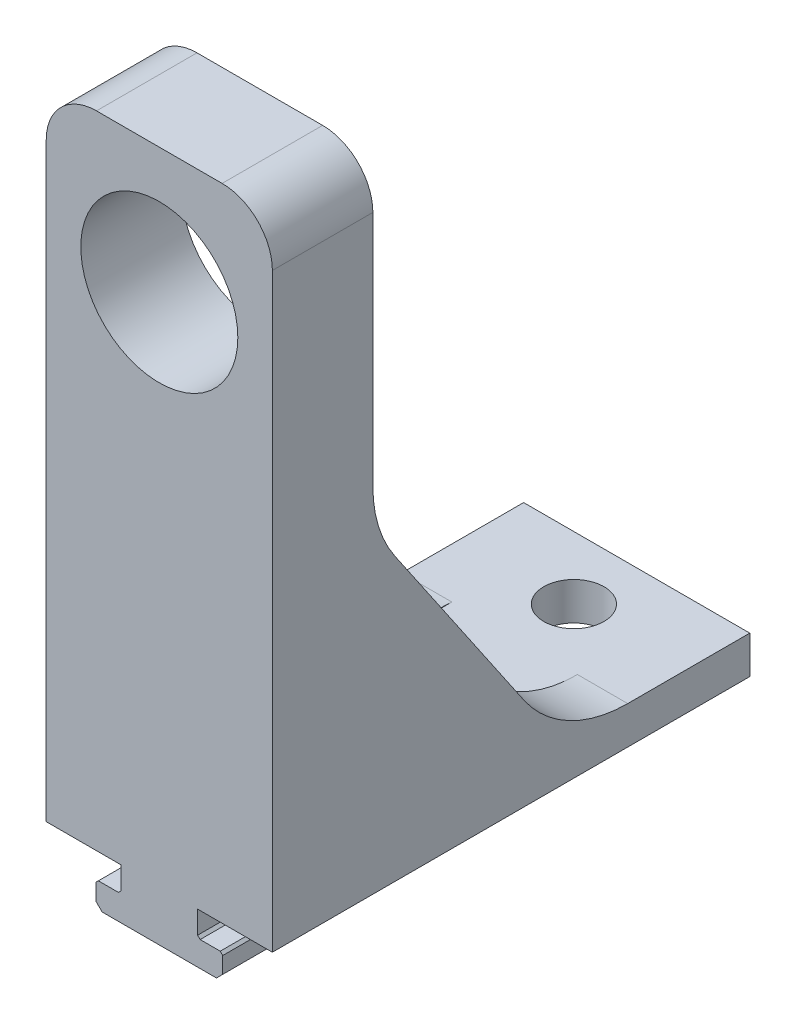
ISO-10303-21;
HEADER;
FILE_DESCRIPTION(('STEP AP214'),'2;1');
FILE_NAME('part.step','',(''),(''),'','','');
FILE_SCHEMA(('AUTOMOTIVE_DESIGN { 1 0 10303 214 1 1 1 1 }'));
ENDSEC;
DATA;
#1=APPLICATION_CONTEXT('core data for automotive mechanical design processes');
#2=APPLICATION_PROTOCOL_DEFINITION('international standard','automotive_design',2000,#1);
#3=PRODUCT_CONTEXT('',#1,'mechanical');
#4=PRODUCT('Part','Part','',(#3));
#5=PRODUCT_RELATED_PRODUCT_CATEGORY('part','',(#4));
#6=PRODUCT_DEFINITION_FORMATION('','',#4);
#7=PRODUCT_DEFINITION_CONTEXT('part definition',#1,'design');
#8=PRODUCT_DEFINITION('design','',#6,#7);
#9=PRODUCT_DEFINITION_SHAPE('','',#8);
#10=(LENGTH_UNIT() NAMED_UNIT(*) SI_UNIT(.MILLI.,.METRE.));
#11=(NAMED_UNIT(*) PLANE_ANGLE_UNIT() SI_UNIT($,.RADIAN.));
#12=(NAMED_UNIT(*) SI_UNIT($,.STERADIAN.) SOLID_ANGLE_UNIT());
#13=UNCERTAINTY_MEASURE_WITH_UNIT(LENGTH_MEASURE(1.E-05),#10,'distance_accuracy_value','');
#14=(GEOMETRIC_REPRESENTATION_CONTEXT(3) GLOBAL_UNCERTAINTY_ASSIGNED_CONTEXT((#13)) GLOBAL_UNIT_ASSIGNED_CONTEXT((#10,
#11,#12)) REPRESENTATION_CONTEXT('',''));
#15=CARTESIAN_POINT('',(0.,0.,0.));
#16=DIRECTION('',(0.,0.,1.));
#17=DIRECTION('',(1.,0.,0.));
#18=AXIS2_PLACEMENT_3D('',#15,#16,#17);
#19=CARTESIAN_POINT('',(0.,10.,-4.));
#20=DIRECTION('',(0.,1.,0.));
#21=DIRECTION('',(0.,0.,1.));
#22=AXIS2_PLACEMENT_3D('',#19,#20,#21);
#23=PLANE('',#22);
#24=CARTESIAN_POINT('',(0.,10.,-29.));
#25=DIRECTION('',(0.,1.,0.));
#26=DIRECTION('',(0.,0.,1.));
#27=AXIS2_PLACEMENT_3D('',#24,#25,#26);
#28=CIRCLE('',#27,2.4);
#29=CARTESIAN_POINT('',(0.,10.,-26.6));
#30=VERTEX_POINT('',#29);
#31=EDGE_CURVE('E243',#30,#30,#28,.T.);
#32=ORIENTED_EDGE('',*,*,#31,.T.);
#33=EDGE_LOOP('',(#32));
#34=FACE_BOUND('',#33,.T.);
#35=DIRECTION('',(0.,0.,1.));
#36=VECTOR('',#35,1.);
#37=CARTESIAN_POINT('',(3.05,10.,-4.));
#38=LINE('',#37,#36);
#39=CARTESIAN_POINT('',(3.05,10.,-22.));
#40=VERTEX_POINT('',#39);
#41=CARTESIAN_POINT('',(3.05,10.,4.));
#42=VERTEX_POINT('',#41);
#43=EDGE_CURVE('E237',#40,#42,#38,.T.);
#44=ORIENTED_EDGE('',*,*,#43,.F.);
#45=DIRECTION('',(-1.,0.,0.));
#46=VECTOR('',#45,1.);
#47=CARTESIAN_POINT('',(0.,10.,-22.));
#48=LINE('',#47,#46);
#49=CARTESIAN_POINT('',(-3.05,10.,-22.));
#50=VERTEX_POINT('',#49);
#51=EDGE_CURVE('E242',#40,#50,#48,.T.);
#52=ORIENTED_EDGE('',*,*,#51,.T.);
#53=DIRECTION('',(0.,0.,1.));
#54=VECTOR('',#53,1.);
#55=CARTESIAN_POINT('',(-3.05,10.,-4.));
#56=LINE('',#55,#54);
#57=CARTESIAN_POINT('',(-3.05,10.,4.));
#58=VERTEX_POINT('',#57);
#59=EDGE_CURVE('E381',#50,#58,#56,.T.);
#60=ORIENTED_EDGE('',*,*,#59,.T.);
#61=DIRECTION('',(-1.,0.,0.));
#62=VECTOR('',#61,1.);
#63=CARTESIAN_POINT('',(0.,10.,4.));
#64=LINE('',#63,#62);
#65=CARTESIAN_POINT('',(-9.,10.,4.));
#66=VERTEX_POINT('',#65);
#67=EDGE_CURVE('E321',#58,#66,#64,.T.);
#68=ORIENTED_EDGE('',*,*,#67,.T.);
#69=DIRECTION('',(0.,0.,1.));
#70=VECTOR('',#69,1.);
#71=CARTESIAN_POINT('',(-9.,10.,-4.));
#72=LINE('',#71,#70);
#73=CARTESIAN_POINT('',(-9.,10.,-34.));
#74=VERTEX_POINT('',#73);
#75=EDGE_CURVE('E383',#74,#66,#72,.T.);
#76=ORIENTED_EDGE('',*,*,#75,.F.);
#77=DIRECTION('',(-1.,0.,0.));
#78=VECTOR('',#77,1.);
#79=CARTESIAN_POINT('',(0.,10.,-34.));
#80=LINE('',#79,#78);
#81=CARTESIAN_POINT('',(9.,10.,-34.));
#82=VERTEX_POINT('',#81);
#83=EDGE_CURVE('E299',#82,#74,#80,.T.);
#84=ORIENTED_EDGE('',*,*,#83,.F.);
#85=DIRECTION('',(0.,0.,1.));
#86=VECTOR('',#85,1.);
#87=CARTESIAN_POINT('',(9.,10.,-4.));
#88=LINE('',#87,#86);
#89=CARTESIAN_POINT('',(9.,10.,4.));
#90=VERTEX_POINT('',#89);
#91=EDGE_CURVE('E250',#82,#90,#88,.T.);
#92=ORIENTED_EDGE('',*,*,#91,.T.);
#93=EDGE_CURVE('E248',#90,#42,#64,.T.);
#94=ORIENTED_EDGE('',*,*,#93,.T.);
#95=EDGE_LOOP('',(#44,#52,#60,#68,#76,#84,#92,#94));
#96=FACE_BOUND('',#95,.T.);
#97=ADVANCED_FACE('F38',(#34,#96),#23,.F.);
#98=CARTESIAN_POINT('',(0.,0.,-4.));
#99=DIRECTION('',(0.,0.,1.));
#100=DIRECTION('',(1.,0.,0.));
#101=AXIS2_PLACEMENT_3D('',#98,#99,#100);
#102=PLANE('',#101);
#103=CARTESIAN_POINT('',(0.,51.,-4.));
#104=DIRECTION('',(0.,0.,1.));
#105=DIRECTION('',(1.,0.,0.));
#106=AXIS2_PLACEMENT_3D('',#103,#104,#105);
#107=CIRCLE('',#106,6.25);
#108=CARTESIAN_POINT('',(6.25,51.,-4.));
#109=VERTEX_POINT('',#108);
#110=EDGE_CURVE('E251',#109,#109,#107,.T.);
#111=ORIENTED_EDGE('',*,*,#110,.T.);
#112=EDGE_LOOP('',(#111));
#113=FACE_BOUND('',#112,.T.);
#114=DIRECTION('',(0.,-1.,0.));
#115=VECTOR('',#114,1.);
#116=CARTESIAN_POINT('',(-5.,0.,-4.));
#117=LINE('',#116,#115);
#118=CARTESIAN_POINT('',(-4.99999999999992,38.0847026075925,-4.));
#119=VERTEX_POINT('',#118);
#120=CARTESIAN_POINT('',(-4.99999999999997,13.,-4.));
#121=VERTEX_POINT('',#120);
#122=EDGE_CURVE('E286',#119,#121,#117,.T.);
#123=ORIENTED_EDGE('',*,*,#122,.F.);
#124=DIRECTION('',(-1.,0.,0.));
#125=VECTOR('',#124,1.);
#126=CARTESIAN_POINT('',(0.,38.0847026075924,-4.));
#127=LINE('',#126,#125);
#128=CARTESIAN_POINT('',(-9.,38.0847026075925,-4.));
#129=VERTEX_POINT('',#128);
#130=EDGE_CURVE('E418',#119,#129,#127,.T.);
#131=ORIENTED_EDGE('',*,*,#130,.T.);
#132=DIRECTION('',(0.,1.,0.));
#133=VECTOR('',#132,1.);
#134=CARTESIAN_POINT('',(-9.,0.,-4.));
#135=LINE('',#134,#133);
#136=CARTESIAN_POINT('',(-9.,57.,-4.));
#137=VERTEX_POINT('',#136);
#138=EDGE_CURVE('E366',#129,#137,#135,.T.);
#139=ORIENTED_EDGE('',*,*,#138,.T.);
#140=CARTESIAN_POINT('',(-5.,57.,-4.));
#141=DIRECTION('',(0.,0.,1.));
#142=DIRECTION('',(1.,0.,0.));
#143=AXIS2_PLACEMENT_3D('',#140,#141,#142);
#144=CIRCLE('',#143,4.);
#145=CARTESIAN_POINT('',(-5.,61.,-4.));
#146=VERTEX_POINT('',#145);
#147=EDGE_CURVE('E364',#137,#146,#144,.F.);
#148=ORIENTED_EDGE('',*,*,#147,.T.);
#149=DIRECTION('',(1.,0.,0.));
#150=VECTOR('',#149,1.);
#151=CARTESIAN_POINT('',(0.,61.,-4.));
#152=LINE('',#151,#150);
#153=CARTESIAN_POINT('',(5.,61.,-4.));
#154=VERTEX_POINT('',#153);
#155=EDGE_CURVE('E362',#146,#154,#152,.T.);
#156=ORIENTED_EDGE('',*,*,#155,.T.);
#157=CARTESIAN_POINT('',(5.,57.,-4.));
#158=DIRECTION('',(0.,0.,1.));
#159=DIRECTION('',(1.,0.,0.));
#160=AXIS2_PLACEMENT_3D('',#157,#158,#159);
#161=CIRCLE('',#160,4.);
#162=CARTESIAN_POINT('',(9.,57.,-4.));
#163=VERTEX_POINT('',#162);
#164=EDGE_CURVE('E360',#154,#163,#161,.F.);
#165=ORIENTED_EDGE('',*,*,#164,.T.);
#166=DIRECTION('',(0.,-1.,0.));
#167=VECTOR('',#166,1.);
#168=CARTESIAN_POINT('',(9.,0.,-4.));
#169=LINE('',#168,#167);
#170=CARTESIAN_POINT('',(9.,38.0847026075925,-4.));
#171=VERTEX_POINT('',#170);
#172=EDGE_CURVE('E357',#163,#171,#169,.T.);
#173=ORIENTED_EDGE('',*,*,#172,.T.);
#174=DIRECTION('',(1.,0.,0.));
#175=VECTOR('',#174,1.);
#176=CARTESIAN_POINT('',(0.,38.0847026075924,-4.));
#177=LINE('',#176,#175);
#178=CARTESIAN_POINT('',(4.99999999999992,38.0847026075924,-4.));
#179=VERTEX_POINT('',#178);
#180=EDGE_CURVE('E415',#171,#179,#177,.F.);
#181=ORIENTED_EDGE('',*,*,#180,.T.);
#182=DIRECTION('',(0.,1.,0.));
#183=VECTOR('',#182,1.);
#184=CARTESIAN_POINT('',(5.,0.,-4.));
#185=LINE('',#184,#183);
#186=CARTESIAN_POINT('',(4.99999999999997,13.,-4.));
#187=VERTEX_POINT('',#186);
#188=EDGE_CURVE('E295',#187,#179,#185,.T.);
#189=ORIENTED_EDGE('',*,*,#188,.F.);
#190=DIRECTION('',(1.,0.,0.));
#191=VECTOR('',#190,1.);
#192=CARTESIAN_POINT('',(0.,13.,-4.));
#193=LINE('',#192,#191);
#194=EDGE_CURVE('E373',#121,#187,#193,.T.);
#195=ORIENTED_EDGE('',*,*,#194,.F.);
#196=EDGE_LOOP('',(#123,#131,#139,#148,#156,#165,#173,#181,#189,#195));
#197=FACE_BOUND('',#196,.T.);
#198=ADVANCED_FACE('F533',(#113,#197),#102,.F.);
#199=CARTESIAN_POINT('',(0.,8.,-4.));
#200=DIRECTION('',(0.,-1.,0.));
#201=DIRECTION('',(1.,0.,0.));
#202=AXIS2_PLACEMENT_3D('',#199,#200,#201);
#203=PLANE('',#202);
#204=DIRECTION('',(1.,0.,0.));
#205=VECTOR('',#204,1.);
#206=CARTESIAN_POINT('',(0.,8.,4.));
#207=LINE('',#206,#205);
#208=CARTESIAN_POINT('',(3.25,8.,4.));
#209=VERTEX_POINT('',#208);
#210=CARTESIAN_POINT('',(4.84999999999999,8.,4.));
#211=VERTEX_POINT('',#210);
#212=EDGE_CURVE('E313',#209,#211,#207,.T.);
#213=ORIENTED_EDGE('',*,*,#212,.T.);
#214=DIRECTION('',(0.,0.,-1.));
#215=VECTOR('',#214,1.);
#216=CARTESIAN_POINT('',(4.84999999999999,8.,-4.));
#217=LINE('',#216,#215);
#218=CARTESIAN_POINT('',(4.84999999999999,8.,-22.));
#219=VERTEX_POINT('',#218);
#220=EDGE_CURVE('E58',#211,#219,#217,.T.);
#221=ORIENTED_EDGE('',*,*,#220,.T.);
#222=DIRECTION('',(-1.,0.,0.));
#223=VECTOR('',#222,1.);
#224=CARTESIAN_POINT('',(0.,8.,-22.));
#225=LINE('',#224,#223);
#226=CARTESIAN_POINT('',(3.25,8.,-22.));
#227=VERTEX_POINT('',#226);
#228=EDGE_CURVE('E280',#219,#227,#225,.T.);
#229=ORIENTED_EDGE('',*,*,#228,.T.);
#230=DIRECTION('',(0.,0.,1.));
#231=VECTOR('',#230,1.);
#232=CARTESIAN_POINT('',(3.25,8.,4.));
#233=LINE('',#232,#231);
#234=EDGE_CURVE('E460',#227,#209,#233,.T.);
#235=ORIENTED_EDGE('',*,*,#234,.T.);
#236=EDGE_LOOP('',(#213,#221,#229,#235));
#237=FACE_BOUND('',#236,.T.);
#238=ADVANCED_FACE('F474',(#237),#203,.F.);
#239=CARTESIAN_POINT('',(5.05,0.,-4.));
#240=DIRECTION('',(-1.,0.,0.));
#241=DIRECTION('',(0.,-1.,0.));
#242=AXIS2_PLACEMENT_3D('',#239,#240,#241);
#243=PLANE('',#242);
#244=DIRECTION('',(0.,1.,0.));
#245=VECTOR('',#244,1.);
#246=CARTESIAN_POINT('',(5.05,0.,-22.));
#247=LINE('',#246,#245);
#248=CARTESIAN_POINT('',(5.05,6.5,-22.));
#249=VERTEX_POINT('',#248);
#250=CARTESIAN_POINT('',(5.05,7.79999999999999,-22.));
#251=VERTEX_POINT('',#250);
#252=EDGE_CURVE('E277',#249,#251,#247,.T.);
#253=ORIENTED_EDGE('',*,*,#252,.T.);
#254=DIRECTION('',(0.,0.,1.));
#255=VECTOR('',#254,1.);
#256=CARTESIAN_POINT('',(5.05,7.79999999999999,-4.));
#257=LINE('',#256,#255);
#258=CARTESIAN_POINT('',(5.05,7.79999999999999,4.));
#259=VERTEX_POINT('',#258);
#260=EDGE_CURVE('E457',#251,#259,#257,.T.);
#261=ORIENTED_EDGE('',*,*,#260,.T.);
#262=DIRECTION('',(0.,-1.,0.));
#263=VECTOR('',#262,1.);
#264=CARTESIAN_POINT('',(5.05,0.,4.));
#265=LINE('',#264,#263);
#266=CARTESIAN_POINT('',(5.05,6.5,4.));
#267=VERTEX_POINT('',#266);
#268=EDGE_CURVE('E352',#259,#267,#265,.T.);
#269=ORIENTED_EDGE('',*,*,#268,.T.);
#270=DIRECTION('',(0.,0.,1.));
#271=VECTOR('',#270,1.);
#272=CARTESIAN_POINT('',(5.05,6.5,-4.));
#273=LINE('',#272,#271);
#274=EDGE_CURVE('E370',#249,#267,#273,.T.);
#275=ORIENTED_EDGE('',*,*,#274,.F.);
#276=EDGE_LOOP('',(#253,#261,#269,#275));
#277=FACE_BOUND('',#276,.T.);
#278=ADVANCED_FACE('F482',(#277),#243,.F.);
#279=CARTESIAN_POINT('',(-0.724999999999999,0.724999999999999,-4.));
#280=DIRECTION('',(-0.707106781186547,0.707106781186547,0.));
#281=DIRECTION('',(-0.707106781186548,-0.707106781186548,0.));
#282=AXIS2_PLACEMENT_3D('',#279,#280,#281);
#283=PLANE('',#282);
#284=DIRECTION('',(-0.707106781186548,-0.707106781186548,0.));
#285=VECTOR('',#284,1.);
#286=CARTESIAN_POINT('',(-0.724999999999999,0.724999999999999,4.));
#287=LINE('',#286,#285);
#288=CARTESIAN_POINT('',(4.55,6.,4.));
#289=VERTEX_POINT('',#288);
#290=EDGE_CURVE('E349',#267,#289,#287,.T.);
#291=ORIENTED_EDGE('',*,*,#290,.T.);
#292=DIRECTION('',(0.,0.,1.));
#293=VECTOR('',#292,1.);
#294=CARTESIAN_POINT('',(4.55,6.,-4.));
#295=LINE('',#294,#293);
#296=CARTESIAN_POINT('',(4.55,6.,-22.));
#297=VERTEX_POINT('',#296);
#298=EDGE_CURVE('E374',#297,#289,#295,.T.);
#299=ORIENTED_EDGE('',*,*,#298,.F.);
#300=DIRECTION('',(0.707106781186548,0.707106781186548,0.));
#301=VECTOR('',#300,1.);
#302=CARTESIAN_POINT('',(-0.724999999999999,0.724999999999999,-22.));
#303=LINE('',#302,#301);
#304=EDGE_CURVE('E274',#297,#249,#303,.T.);
#305=ORIENTED_EDGE('',*,*,#304,.T.);
#306=ORIENTED_EDGE('',*,*,#274,.T.);
#307=EDGE_LOOP('',(#291,#299,#305,#306));
#308=FACE_BOUND('',#307,.T.);
#309=ADVANCED_FACE('F486',(#308),#283,.F.);
#310=CARTESIAN_POINT('',(0.,6.,-4.));
#311=DIRECTION('',(0.,-1.,0.));
#312=DIRECTION('',(0.,0.,-1.));
#313=AXIS2_PLACEMENT_3D('',#310,#311,#312);
#314=PLANE('',#313);
#315=DIRECTION('',(1.,0.,0.));
#316=VECTOR('',#315,1.);
#317=CARTESIAN_POINT('',(0.,6.,4.));
#318=LINE('',#317,#316);
#319=CARTESIAN_POINT('',(-4.55,6.,4.));
#320=VERTEX_POINT('',#319);
#321=EDGE_CURVE('E346',#320,#289,#318,.T.);
#322=ORIENTED_EDGE('',*,*,#321,.F.);
#323=DIRECTION('',(0.,0.,1.));
#324=VECTOR('',#323,1.);
#325=CARTESIAN_POINT('',(-4.55,6.,-4.));
#326=LINE('',#325,#324);
#327=CARTESIAN_POINT('',(-4.55,6.,-22.));
#328=VERTEX_POINT('',#327);
#329=EDGE_CURVE('E376',#328,#320,#326,.T.);
#330=ORIENTED_EDGE('',*,*,#329,.F.);
#331=DIRECTION('',(-1.,0.,0.));
#332=VECTOR('',#331,1.);
#333=CARTESIAN_POINT('',(0.,6.,-22.));
#334=LINE('',#333,#332);
#335=EDGE_CURVE('E271',#297,#328,#334,.T.);
#336=ORIENTED_EDGE('',*,*,#335,.F.);
#337=ORIENTED_EDGE('',*,*,#298,.T.);
#338=EDGE_LOOP('',(#322,#330,#336,#337));
#339=FACE_BOUND('',#338,.T.);
#340=ADVANCED_FACE('F491',(#339),#314,.T.);
#341=CARTESIAN_POINT('',(0.724999999999999,0.724999999999999,-4.));
#342=DIRECTION('',(-0.707106781186547,-0.707106781186547,0.));
#343=DIRECTION('',(0.707106781186548,-0.707106781186548,0.));
#344=AXIS2_PLACEMENT_3D('',#341,#342,#343);
#345=PLANE('',#344);
#346=DIRECTION('',(0.707106781186548,-0.707106781186548,0.));
#347=VECTOR('',#346,1.);
#348=CARTESIAN_POINT('',(0.724999999999999,0.724999999999999,4.));
#349=LINE('',#348,#347);
#350=CARTESIAN_POINT('',(-5.05,6.5,4.));
#351=VERTEX_POINT('',#350);
#352=EDGE_CURVE('E343',#351,#320,#349,.T.);
#353=ORIENTED_EDGE('',*,*,#352,.F.);
#354=DIRECTION('',(0.,0.,1.));
#355=VECTOR('',#354,1.);
#356=CARTESIAN_POINT('',(-5.05,6.5,-4.));
#357=LINE('',#356,#355);
#358=CARTESIAN_POINT('',(-5.05,6.5,-22.));
#359=VERTEX_POINT('',#358);
#360=EDGE_CURVE('E378',#359,#351,#357,.T.);
#361=ORIENTED_EDGE('',*,*,#360,.F.);
#362=DIRECTION('',(-0.707106781186548,0.707106781186548,0.));
#363=VECTOR('',#362,1.);
#364=CARTESIAN_POINT('',(0.724999999999999,0.724999999999999,-22.));
#365=LINE('',#364,#363);
#366=EDGE_CURVE('E268',#328,#359,#365,.T.);
#367=ORIENTED_EDGE('',*,*,#366,.F.);
#368=ORIENTED_EDGE('',*,*,#329,.T.);
#369=EDGE_LOOP('',(#353,#361,#367,#368));
#370=FACE_BOUND('',#369,.T.);
#371=ADVANCED_FACE('F494',(#370),#345,.T.);
#372=CARTESIAN_POINT('',(-5.05,0.,-4.));
#373=DIRECTION('',(-1.,0.,0.));
#374=DIRECTION('',(0.,-1.,0.));
#375=AXIS2_PLACEMENT_3D('',#372,#373,#374);
#376=PLANE('',#375);
#377=DIRECTION('',(0.,-1.,0.));
#378=VECTOR('',#377,1.);
#379=CARTESIAN_POINT('',(-5.05,0.,4.));
#380=LINE('',#379,#378);
#381=CARTESIAN_POINT('',(-5.05,7.80000000000001,4.));
#382=VERTEX_POINT('',#381);
#383=EDGE_CURVE('E341',#382,#351,#380,.T.);
#384=ORIENTED_EDGE('',*,*,#383,.F.);
#385=DIRECTION('',(0.,0.,-1.));
#386=VECTOR('',#385,1.);
#387=CARTESIAN_POINT('',(-5.05,7.80000000000001,-4.));
#388=LINE('',#387,#386);
#389=CARTESIAN_POINT('',(-5.05,7.80000000000001,-22.));
#390=VERTEX_POINT('',#389);
#391=EDGE_CURVE('E448',#382,#390,#388,.T.);
#392=ORIENTED_EDGE('',*,*,#391,.T.);
#393=DIRECTION('',(0.,1.,0.));
#394=VECTOR('',#393,1.);
#395=CARTESIAN_POINT('',(-5.05,0.,-22.));
#396=LINE('',#395,#394);
#397=EDGE_CURVE('E266',#359,#390,#396,.T.);
#398=ORIENTED_EDGE('',*,*,#397,.F.);
#399=ORIENTED_EDGE('',*,*,#360,.T.);
#400=EDGE_LOOP('',(#384,#392,#398,#399));
#401=FACE_BOUND('',#400,.T.);
#402=ADVANCED_FACE('F499',(#401),#376,.T.);
#403=CARTESIAN_POINT('',(0.,8.,-4.));
#404=DIRECTION('',(0.,1.,0.));
#405=DIRECTION('',(-1.,0.,0.));
#406=AXIS2_PLACEMENT_3D('',#403,#404,#405);
#407=PLANE('',#406);
#408=DIRECTION('',(1.,0.,0.));
#409=VECTOR('',#408,1.);
#410=CARTESIAN_POINT('',(0.,8.,-22.));
#411=LINE('',#410,#409);
#412=CARTESIAN_POINT('',(-4.85000000000001,8.,-22.));
#413=VERTEX_POINT('',#412);
#414=CARTESIAN_POINT('',(-3.24999999999999,8.,-22.));
#415=VERTEX_POINT('',#414);
#416=EDGE_CURVE('E259',#413,#415,#411,.T.);
#417=ORIENTED_EDGE('',*,*,#416,.F.);
#418=DIRECTION('',(0.,0.,1.));
#419=VECTOR('',#418,1.);
#420=CARTESIAN_POINT('',(-4.85000000000001,8.,-4.));
#421=LINE('',#420,#419);
#422=CARTESIAN_POINT('',(-4.85000000000001,8.,4.));
#423=VERTEX_POINT('',#422);
#424=EDGE_CURVE('E441',#413,#423,#421,.T.);
#425=ORIENTED_EDGE('',*,*,#424,.T.);
#426=DIRECTION('',(-1.,0.,0.));
#427=VECTOR('',#426,1.);
#428=CARTESIAN_POINT('',(0.,8.,4.));
#429=LINE('',#428,#427);
#430=CARTESIAN_POINT('',(-3.24999999999999,8.,4.));
#431=VERTEX_POINT('',#430);
#432=EDGE_CURVE('E338',#431,#423,#429,.T.);
#433=ORIENTED_EDGE('',*,*,#432,.F.);
#434=DIRECTION('',(0.,0.,-1.));
#435=VECTOR('',#434,1.);
#436=CARTESIAN_POINT('',(-3.24999999999999,8.,-22.));
#437=LINE('',#436,#435);
#438=EDGE_CURVE('E439',#431,#415,#437,.T.);
#439=ORIENTED_EDGE('',*,*,#438,.T.);
#440=EDGE_LOOP('',(#417,#425,#433,#439));
#441=FACE_BOUND('',#440,.T.);
#442=ADVANCED_FACE('F507',(#441),#407,.T.);
#443=CARTESIAN_POINT('',(-3.05,0.,-4.));
#444=DIRECTION('',(-1.,0.,0.));
#445=DIRECTION('',(0.,-1.,0.));
#446=AXIS2_PLACEMENT_3D('',#443,#444,#445);
#447=PLANE('',#446);
#448=DIRECTION('',(0.,1.,0.));
#449=VECTOR('',#448,1.);
#450=CARTESIAN_POINT('',(-3.05,0.,-22.));
#451=LINE('',#450,#449);
#452=CARTESIAN_POINT('',(-3.05,8.2,-22.));
#453=VERTEX_POINT('',#452);
#454=EDGE_CURVE('E256',#453,#50,#451,.T.);
#455=ORIENTED_EDGE('',*,*,#454,.F.);
#456=DIRECTION('',(0.,0.,1.));
#457=VECTOR('',#456,1.);
#458=CARTESIAN_POINT('',(-3.05,8.2,4.));
#459=LINE('',#458,#457);
#460=CARTESIAN_POINT('',(-3.05,8.2,4.));
#461=VERTEX_POINT('',#460);
#462=EDGE_CURVE('E454',#453,#461,#459,.T.);
#463=ORIENTED_EDGE('',*,*,#462,.T.);
#464=DIRECTION('',(0.,-1.,0.));
#465=VECTOR('',#464,1.);
#466=CARTESIAN_POINT('',(-3.05,0.,4.));
#467=LINE('',#466,#465);
#468=EDGE_CURVE('E335',#58,#461,#467,.T.);
#469=ORIENTED_EDGE('',*,*,#468,.F.);
#470=ORIENTED_EDGE('',*,*,#59,.F.);
#471=EDGE_LOOP('',(#455,#463,#469,#470));
#472=FACE_BOUND('',#471,.T.);
#473=ADVANCED_FACE('F516',(#472),#447,.T.);
#474=CARTESIAN_POINT('',(-9.,0.,-4.));
#475=DIRECTION('',(1.,0.,0.));
#476=DIRECTION('',(0.,0.,-1.));
#477=AXIS2_PLACEMENT_3D('',#474,#475,#476);
#478=PLANE('',#477);
#479=ORIENTED_EDGE('',*,*,#138,.F.);
#480=CARTESIAN_POINT('',(-9.,38.0847026075925,-14.));
#481=DIRECTION('',(1.,0.,0.));
#482=DIRECTION('',(0.,0.,-1.));
#483=AXIS2_PLACEMENT_3D('',#480,#481,#482);
#484=CIRCLE('',#483,10.);
#485=CARTESIAN_POINT('',(-8.99999999999993,32.4513343611774,-5.73772657192452));
#486=VERTEX_POINT('',#485);
#487=EDGE_CURVE('E430',#129,#486,#484,.T.);
#488=ORIENTED_EDGE('',*,*,#487,.T.);
#489=DIRECTION('',(0.,-0.826227342807548,-0.56333682464151));
#490=VECTOR('',#489,1.);
#491=CARTESIAN_POINT('',(-8.99999999999993,35.,-4.));
#492=LINE('',#491,#490);
#493=CARTESIAN_POINT('',(-8.99999999999996,17.3666317535849,-16.0227510771012));
#494=VERTEX_POINT('',#493);
#495=EDGE_CURVE('E283',#486,#494,#492,.T.);
#496=ORIENTED_EDGE('',*,*,#495,.T.);
#497=CARTESIAN_POINT('',(-9.,23.,-24.2850245051767));
#498=DIRECTION('',(1.,0.,0.));
#499=DIRECTION('',(0.,0.,-1.));
#500=AXIS2_PLACEMENT_3D('',#497,#498,#499);
#501=CIRCLE('',#500,10.);
#502=CARTESIAN_POINT('',(-9.,13.,-24.2850245051767));
#503=VERTEX_POINT('',#502);
#504=EDGE_CURVE('E428',#494,#503,#501,.T.);
#505=ORIENTED_EDGE('',*,*,#504,.T.);
#506=DIRECTION('',(0.,0.,1.));
#507=VECTOR('',#506,1.);
#508=CARTESIAN_POINT('',(-9.,13.,-34.));
#509=LINE('',#508,#507);
#510=CARTESIAN_POINT('',(-9.,13.,-34.));
#511=VERTEX_POINT('',#510);
#512=EDGE_CURVE('E310',#511,#503,#509,.T.);
#513=ORIENTED_EDGE('',*,*,#512,.F.);
#514=DIRECTION('',(0.,1.,0.));
#515=VECTOR('',#514,1.);
#516=CARTESIAN_POINT('',(-9.,0.,-34.));
#517=LINE('',#516,#515);
#518=EDGE_CURVE('E307',#74,#511,#517,.T.);
#519=ORIENTED_EDGE('',*,*,#518,.F.);
#520=ORIENTED_EDGE('',*,*,#75,.T.);
#521=DIRECTION('',(0.,1.,0.));
#522=VECTOR('',#521,1.);
#523=CARTESIAN_POINT('',(-9.,0.,4.));
#524=LINE('',#523,#522);
#525=CARTESIAN_POINT('',(-9.,57.,4.));
#526=VERTEX_POINT('',#525);
#527=EDGE_CURVE('E333',#66,#526,#524,.T.);
#528=ORIENTED_EDGE('',*,*,#527,.T.);
#529=DIRECTION('',(0.,0.,1.));
#530=VECTOR('',#529,1.);
#531=CARTESIAN_POINT('',(-9.,57.,-4.));
#532=LINE('',#531,#530);
#533=EDGE_CURVE('E385',#137,#526,#532,.T.);
#534=ORIENTED_EDGE('',*,*,#533,.F.);
#535=EDGE_LOOP('',(#479,#488,#496,#505,#513,#519,#520,#528,#534));
#536=FACE_BOUND('',#535,.T.);
#537=ADVANCED_FACE('F526',(#536),#478,.F.);
#538=CARTESIAN_POINT('',(-5.,57.,-4.));
#539=DIRECTION('',(0.,0.,1.));
#540=DIRECTION('',(1.,0.,0.));
#541=AXIS2_PLACEMENT_3D('',#538,#539,#540);
#542=CYLINDRICAL_SURFACE('',#541,4.);
#543=ORIENTED_EDGE('',*,*,#533,.T.);
#544=CARTESIAN_POINT('',(-5.,57.,4.));
#545=DIRECTION('',(0.,0.,1.));
#546=DIRECTION('',(1.,0.,0.));
#547=AXIS2_PLACEMENT_3D('',#544,#545,#546);
#548=CIRCLE('',#547,4.);
#549=CARTESIAN_POINT('',(-5.,61.,4.));
#550=VERTEX_POINT('',#549);
#551=EDGE_CURVE('E330',#526,#550,#548,.F.);
#552=ORIENTED_EDGE('',*,*,#551,.T.);
#553=DIRECTION('',(0.,0.,1.));
#554=VECTOR('',#553,1.);
#555=CARTESIAN_POINT('',(-5.,61.,-4.));
#556=LINE('',#555,#554);
#557=EDGE_CURVE('E388',#146,#550,#556,.T.);
#558=ORIENTED_EDGE('',*,*,#557,.F.);
#559=ORIENTED_EDGE('',*,*,#147,.F.);
#560=EDGE_LOOP('',(#543,#552,#558,#559));
#561=FACE_BOUND('',#560,.T.);
#562=ADVANCED_FACE('F529',(#561),#542,.T.);
#563=CARTESIAN_POINT('',(0.,61.,-4.));
#564=DIRECTION('',(0.,-1.,0.));
#565=DIRECTION('',(0.,0.,-1.));
#566=AXIS2_PLACEMENT_3D('',#563,#564,#565);
#567=PLANE('',#566);
#568=ORIENTED_EDGE('',*,*,#557,.T.);
#569=DIRECTION('',(1.,0.,0.));
#570=VECTOR('',#569,1.);
#571=CARTESIAN_POINT('',(0.,61.,4.));
#572=LINE('',#571,#570);
#573=CARTESIAN_POINT('',(5.,61.,4.));
#574=VERTEX_POINT('',#573);
#575=EDGE_CURVE('E327',#550,#574,#572,.T.);
#576=ORIENTED_EDGE('',*,*,#575,.T.);
#577=DIRECTION('',(0.,0.,1.));
#578=VECTOR('',#577,1.);
#579=CARTESIAN_POINT('',(5.,61.,-4.));
#580=LINE('',#579,#578);
#581=EDGE_CURVE('E390',#154,#574,#580,.T.);
#582=ORIENTED_EDGE('',*,*,#581,.F.);
#583=ORIENTED_EDGE('',*,*,#155,.F.);
#584=EDGE_LOOP('',(#568,#576,#582,#583));
#585=FACE_BOUND('',#584,.T.);
#586=ADVANCED_FACE('F570',(#585),#567,.F.);
#587=CARTESIAN_POINT('',(5.,57.,-4.));
#588=DIRECTION('',(0.,0.,1.));
#589=DIRECTION('',(1.,0.,0.));
#590=AXIS2_PLACEMENT_3D('',#587,#588,#589);
#591=CYLINDRICAL_SURFACE('',#590,4.);
#592=ORIENTED_EDGE('',*,*,#581,.T.);
#593=CARTESIAN_POINT('',(5.,57.,4.));
#594=DIRECTION('',(0.,0.,1.));
#595=DIRECTION('',(1.,0.,0.));
#596=AXIS2_PLACEMENT_3D('',#593,#594,#595);
#597=CIRCLE('',#596,4.);
#598=CARTESIAN_POINT('',(9.,57.,4.));
#599=VERTEX_POINT('',#598);
#600=EDGE_CURVE('E324',#574,#599,#597,.F.);
#601=ORIENTED_EDGE('',*,*,#600,.T.);
#602=DIRECTION('',(0.,0.,1.));
#603=VECTOR('',#602,1.);
#604=CARTESIAN_POINT('',(9.,57.,-4.));
#605=LINE('',#604,#603);
#606=EDGE_CURVE('E392',#163,#599,#605,.T.);
#607=ORIENTED_EDGE('',*,*,#606,.F.);
#608=ORIENTED_EDGE('',*,*,#164,.F.);
#609=EDGE_LOOP('',(#592,#601,#607,#608));
#610=FACE_BOUND('',#609,.T.);
#611=ADVANCED_FACE('F567',(#610),#591,.T.);
#612=CARTESIAN_POINT('',(9.,0.,-4.));
#613=DIRECTION('',(-1.,0.,0.));
#614=DIRECTION('',(0.,0.,1.));
#615=AXIS2_PLACEMENT_3D('',#612,#613,#614);
#616=PLANE('',#615);
#617=DIRECTION('',(0.,0.,1.));
#618=VECTOR('',#617,1.);
#619=CARTESIAN_POINT('',(9.,13.,-34.));
#620=LINE('',#619,#618);
#621=CARTESIAN_POINT('',(9.,13.,-34.));
#622=VERTEX_POINT('',#621);
#623=CARTESIAN_POINT('',(9.,13.,-24.2850245051767));
#624=VERTEX_POINT('',#623);
#625=EDGE_CURVE('E309',#622,#624,#620,.T.);
#626=ORIENTED_EDGE('',*,*,#625,.T.);
#627=CARTESIAN_POINT('',(9.,23.,-24.2850245051767));
#628=DIRECTION('',(-1.,0.,0.));
#629=DIRECTION('',(0.,0.,1.));
#630=AXIS2_PLACEMENT_3D('',#627,#628,#629);
#631=CIRCLE('',#630,10.);
#632=CARTESIAN_POINT('',(8.99999999999996,17.3666317535849,-16.0227510771012));
#633=VERTEX_POINT('',#632);
#634=EDGE_CURVE('E421',#624,#633,#631,.T.);
#635=ORIENTED_EDGE('',*,*,#634,.T.);
#636=DIRECTION('',(0.,-0.826227342807548,-0.56333682464151));
#637=VECTOR('',#636,1.);
#638=CARTESIAN_POINT('',(8.99999999999993,35.,-4.));
#639=LINE('',#638,#637);
#640=CARTESIAN_POINT('',(8.99999999999993,32.4513343611774,-5.73772657192452));
#641=VERTEX_POINT('',#640);
#642=EDGE_CURVE('E292',#641,#633,#639,.T.);
#643=ORIENTED_EDGE('',*,*,#642,.F.);
#644=CARTESIAN_POINT('',(9.,38.0847026075925,-14.));
#645=DIRECTION('',(-1.,0.,0.));
#646=DIRECTION('',(0.,0.,1.));
#647=AXIS2_PLACEMENT_3D('',#644,#645,#646);
#648=CIRCLE('',#647,10.);
#649=EDGE_CURVE('E437',#641,#171,#648,.T.);
#650=ORIENTED_EDGE('',*,*,#649,.T.);
#651=ORIENTED_EDGE('',*,*,#172,.F.);
#652=ORIENTED_EDGE('',*,*,#606,.T.);
#653=DIRECTION('',(0.,-1.,0.));
#654=VECTOR('',#653,1.);
#655=CARTESIAN_POINT('',(9.,0.,4.));
#656=LINE('',#655,#654);
#657=EDGE_CURVE('E320',#599,#90,#656,.T.);
#658=ORIENTED_EDGE('',*,*,#657,.T.);
#659=ORIENTED_EDGE('',*,*,#91,.F.);
#660=DIRECTION('',(0.,-1.,0.));
#661=VECTOR('',#660,1.);
#662=CARTESIAN_POINT('',(9.,0.,-34.));
#663=LINE('',#662,#661);
#664=EDGE_CURVE('E302',#622,#82,#663,.T.);
#665=ORIENTED_EDGE('',*,*,#664,.F.);
#666=EDGE_LOOP('',(#626,#635,#643,#650,#651,#652,#658,#659,#665));
#667=FACE_BOUND('',#666,.T.);
#668=ADVANCED_FACE('F562',(#667),#616,.F.);
#669=CARTESIAN_POINT('',(3.05,0.,-4.));
#670=DIRECTION('',(-1.,0.,0.));
#671=DIRECTION('',(0.,-1.,0.));
#672=AXIS2_PLACEMENT_3D('',#669,#670,#671);
#673=PLANE('',#672);
#674=DIRECTION('',(0.,-1.,0.));
#675=VECTOR('',#674,1.);
#676=CARTESIAN_POINT('',(3.05,0.,4.));
#677=LINE('',#676,#675);
#678=CARTESIAN_POINT('',(3.05,8.19999999999999,4.));
#679=VERTEX_POINT('',#678);
#680=EDGE_CURVE('E317',#42,#679,#677,.T.);
#681=ORIENTED_EDGE('',*,*,#680,.T.);
#682=DIRECTION('',(0.,0.,-1.));
#683=VECTOR('',#682,1.);
#684=CARTESIAN_POINT('',(3.05,8.19999999999999,-22.));
#685=LINE('',#684,#683);
#686=CARTESIAN_POINT('',(3.05,8.19999999999999,-22.));
#687=VERTEX_POINT('',#686);
#688=EDGE_CURVE('E240',#679,#687,#685,.T.);
#689=ORIENTED_EDGE('',*,*,#688,.T.);
#690=DIRECTION('',(0.,1.,0.));
#691=VECTOR('',#690,1.);
#692=CARTESIAN_POINT('',(3.05,0.,-22.));
#693=LINE('',#692,#691);
#694=EDGE_CURVE('E233',#687,#40,#693,.T.);
#695=ORIENTED_EDGE('',*,*,#694,.T.);
#696=ORIENTED_EDGE('',*,*,#43,.T.);
#697=EDGE_LOOP('',(#681,#689,#695,#696));
#698=FACE_BOUND('',#697,.T.);
#699=ADVANCED_FACE('F236',(#698),#673,.F.);
#700=CARTESIAN_POINT('',(0.,51.,-4.));
#701=DIRECTION('',(0.,0.,1.));
#702=DIRECTION('',(1.,0.,0.));
#703=AXIS2_PLACEMENT_3D('',#700,#701,#702);
#704=CYLINDRICAL_SURFACE('',#703,6.25);
#705=ORIENTED_EDGE('',*,*,#110,.F.);
#706=EDGE_LOOP('',(#705));
#707=FACE_BOUND('',#706,.T.);
#708=CARTESIAN_POINT('',(0.,51.,4.));
#709=DIRECTION('',(0.,0.,1.));
#710=DIRECTION('',(1.,0.,0.));
#711=AXIS2_PLACEMENT_3D('',#708,#709,#710);
#712=CIRCLE('',#711,6.25);
#713=CARTESIAN_POINT('',(6.25,51.,4.));
#714=VERTEX_POINT('',#713);
#715=EDGE_CURVE('E354',#714,#714,#712,.T.);
#716=ORIENTED_EDGE('',*,*,#715,.T.);
#717=EDGE_LOOP('',(#716));
#718=FACE_BOUND('',#717,.T.);
#719=ADVANCED_FACE('F611',(#707,#718),#704,.F.);
#720=CARTESIAN_POINT('',(0.,0.,4.));
#721=DIRECTION('',(0.,0.,1.));
#722=DIRECTION('',(1.,0.,0.));
#723=AXIS2_PLACEMENT_3D('',#720,#721,#722);
#724=PLANE('',#723);
#725=ORIENTED_EDGE('',*,*,#432,.T.);
#726=DIRECTION('',(0.707106781186546,0.707106781186549,0.));
#727=VECTOR('',#726,1.);
#728=CARTESIAN_POINT('',(-6.42500000000002,6.42499999999999,4.));
#729=LINE('',#728,#727);
#730=EDGE_CURVE('E446',#423,#382,#729,.F.);
#731=ORIENTED_EDGE('',*,*,#730,.T.);
#732=ORIENTED_EDGE('',*,*,#383,.T.);
#733=ORIENTED_EDGE('',*,*,#352,.T.);
#734=ORIENTED_EDGE('',*,*,#321,.T.);
#735=ORIENTED_EDGE('',*,*,#290,.F.);
#736=ORIENTED_EDGE('',*,*,#268,.F.);
#737=DIRECTION('',(0.707106781186546,-0.707106781186549,0.));
#738=VECTOR('',#737,1.);
#739=CARTESIAN_POINT('',(6.42500000000001,6.42499999999998,4.));
#740=LINE('',#739,#738);
#741=EDGE_CURVE('E444',#259,#211,#740,.F.);
#742=ORIENTED_EDGE('',*,*,#741,.T.);
#743=ORIENTED_EDGE('',*,*,#212,.F.);
#744=DIRECTION('',(0.70710678118656,-0.707106781186535,0.));
#745=VECTOR('',#744,1.);
#746=CARTESIAN_POINT('',(3.25,8.,4.));
#747=LINE('',#746,#745);
#748=EDGE_CURVE('E46',#209,#679,#747,.F.);
#749=ORIENTED_EDGE('',*,*,#748,.T.);
#750=ORIENTED_EDGE('',*,*,#680,.F.);
#751=ORIENTED_EDGE('',*,*,#93,.F.);
#752=ORIENTED_EDGE('',*,*,#657,.F.);
#753=ORIENTED_EDGE('',*,*,#600,.F.);
#754=ORIENTED_EDGE('',*,*,#575,.F.);
#755=ORIENTED_EDGE('',*,*,#551,.F.);
#756=ORIENTED_EDGE('',*,*,#527,.F.);
#757=ORIENTED_EDGE('',*,*,#67,.F.);
#758=ORIENTED_EDGE('',*,*,#468,.T.);
#759=DIRECTION('',(0.707106781186535,0.70710678118656,0.));
#760=VECTOR('',#759,1.);
#761=CARTESIAN_POINT('',(-3.05,8.2,4.));
#762=LINE('',#761,#760);
#763=EDGE_CURVE('E465',#461,#431,#762,.F.);
#764=ORIENTED_EDGE('',*,*,#763,.T.);
#765=EDGE_LOOP('',(#725,#731,#732,#733,#734,#735,#736,#742,#743,#749,#750,#751,#752,#753,#754,
#755,#756,#757,#758,#764));
#766=FACE_BOUND('',#765,.T.);
#767=ORIENTED_EDGE('',*,*,#715,.F.);
#768=EDGE_LOOP('',(#767));
#769=FACE_BOUND('',#768,.T.);
#770=ADVANCED_FACE('F470',(#766,#769),#724,.T.);
#771=CARTESIAN_POINT('',(0.,13.,-34.));
#772=DIRECTION('',(0.,-1.,0.));
#773=DIRECTION('',(0.,0.,-1.));
#774=AXIS2_PLACEMENT_3D('',#771,#772,#773);
#775=PLANE('',#774);
#776=CARTESIAN_POINT('',(0.,13.,-29.));
#777=DIRECTION('',(0.,1.,0.));
#778=DIRECTION('',(0.,0.,1.));
#779=AXIS2_PLACEMENT_3D('',#776,#777,#778);
#780=CIRCLE('',#779,2.4);
#781=CARTESIAN_POINT('',(0.,13.,-26.6));
#782=VERTEX_POINT('',#781);
#783=EDGE_CURVE('E647',#782,#782,#780,.T.);
#784=ORIENTED_EDGE('',*,*,#783,.F.);
#785=EDGE_LOOP('',(#784));
#786=FACE_BOUND('',#785,.T.);
#787=DIRECTION('',(0.,0.,1.));
#788=VECTOR('',#787,1.);
#789=CARTESIAN_POINT('',(4.99999999999997,13.,-34.));
#790=LINE('',#789,#788);
#791=CARTESIAN_POINT('',(4.99999999999997,13.,-24.2850245051767));
#792=VERTEX_POINT('',#791);
#793=EDGE_CURVE('E396',#792,#187,#790,.T.);
#794=ORIENTED_EDGE('',*,*,#793,.F.);
#795=DIRECTION('',(-1.,0.,0.));
#796=VECTOR('',#795,1.);
#797=CARTESIAN_POINT('',(0.,13.,-24.2850245051767));
#798=LINE('',#797,#796);
#799=EDGE_CURVE('E404',#792,#624,#798,.F.);
#800=ORIENTED_EDGE('',*,*,#799,.T.);
#801=ORIENTED_EDGE('',*,*,#625,.F.);
#802=DIRECTION('',(1.,0.,0.));
#803=VECTOR('',#802,1.);
#804=CARTESIAN_POINT('',(0.,13.,-34.));
#805=LINE('',#804,#803);
#806=EDGE_CURVE('E305',#511,#622,#805,.T.);
#807=ORIENTED_EDGE('',*,*,#806,.F.);
#808=ORIENTED_EDGE('',*,*,#512,.T.);
#809=DIRECTION('',(1.,0.,0.));
#810=VECTOR('',#809,1.);
#811=CARTESIAN_POINT('',(0.,13.,-24.2850245051767));
#812=LINE('',#811,#810);
#813=CARTESIAN_POINT('',(-4.99999999999997,13.,-24.2850245051767));
#814=VERTEX_POINT('',#813);
#815=EDGE_CURVE('E401',#503,#814,#812,.T.);
#816=ORIENTED_EDGE('',*,*,#815,.T.);
#817=DIRECTION('',(0.,0.,-1.));
#818=VECTOR('',#817,1.);
#819=CARTESIAN_POINT('',(-4.99999999999997,13.,-34.));
#820=LINE('',#819,#818);
#821=EDGE_CURVE('E399',#121,#814,#820,.T.);
#822=ORIENTED_EDGE('',*,*,#821,.F.);
#823=ORIENTED_EDGE('',*,*,#194,.T.);
#824=EDGE_LOOP('',(#794,#800,#801,#807,#808,#816,#822,#823));
#825=FACE_BOUND('',#824,.T.);
#826=ADVANCED_FACE('F555',(#786,#825),#775,.F.);
#827=CARTESIAN_POINT('',(0.,0.,-34.));
#828=DIRECTION('',(0.,0.,1.));
#829=DIRECTION('',(1.,0.,0.));
#830=AXIS2_PLACEMENT_3D('',#827,#828,#829);
#831=PLANE('',#830);
#832=ORIENTED_EDGE('',*,*,#83,.T.);
#833=ORIENTED_EDGE('',*,*,#518,.T.);
#834=ORIENTED_EDGE('',*,*,#806,.T.);
#835=ORIENTED_EDGE('',*,*,#664,.T.);
#836=EDGE_LOOP('',(#832,#833,#834,#835));
#837=FACE_BOUND('',#836,.T.);
#838=ADVANCED_FACE('F559',(#837),#831,.F.);
#839=CARTESIAN_POINT('',(8.99999999999993,35.,-4.));
#840=DIRECTION('',(0.,-0.56333682464151,0.826227342807548));
#841=DIRECTION('',(0.,-0.826227342807548,-0.56333682464151));
#842=AXIS2_PLACEMENT_3D('',#839,#840,#841);
#843=PLANE('',#842);
#844=ORIENTED_EDGE('',*,*,#642,.T.);
#845=DIRECTION('',(1.,0.,0.));
#846=VECTOR('',#845,1.);
#847=CARTESIAN_POINT('',(8.99999999999991,17.3666317535849,-16.0227510771012));
#848=LINE('',#847,#846);
#849=CARTESIAN_POINT('',(4.99999999999996,17.3666317535849,-16.0227510771012));
#850=VERTEX_POINT('',#849);
#851=EDGE_CURVE('E409',#633,#850,#848,.F.);
#852=ORIENTED_EDGE('',*,*,#851,.T.);
#853=DIRECTION('',(0.,-0.826227342807548,-0.56333682464151));
#854=VECTOR('',#853,1.);
#855=CARTESIAN_POINT('',(4.99999999999993,35.,-4.));
#856=LINE('',#855,#854);
#857=CARTESIAN_POINT('',(4.99999999999993,32.4513343611774,-5.73772657192452));
#858=VERTEX_POINT('',#857);
#859=EDGE_CURVE('E291',#858,#850,#856,.T.);
#860=ORIENTED_EDGE('',*,*,#859,.F.);
#861=DIRECTION('',(-1.,0.,0.));
#862=VECTOR('',#861,1.);
#863=CARTESIAN_POINT('',(8.99999999999993,32.4513343611774,-5.73772657192452));
#864=LINE('',#863,#862);
#865=EDGE_CURVE('E407',#858,#641,#864,.F.);
#866=ORIENTED_EDGE('',*,*,#865,.T.);
#867=EDGE_LOOP('',(#844,#852,#860,#866));
#868=FACE_BOUND('',#867,.T.);
#869=ADVANCED_FACE('F622',(#868),#843,.F.);
#870=CARTESIAN_POINT('',(4.99999999999993,33.5,-15.));
#871=DIRECTION('',(1.,0.,0.));
#872=DIRECTION('',(0.,1.,0.));
#873=AXIS2_PLACEMENT_3D('',#870,#871,#872);
#874=PLANE('',#873);
#875=ORIENTED_EDGE('',*,*,#793,.T.);
#876=ORIENTED_EDGE('',*,*,#188,.T.);
#877=CARTESIAN_POINT('',(4.99999999999992,38.0847026075924,-14.));
#878=DIRECTION('',(1.,0.,0.));
#879=DIRECTION('',(0.,1.,0.));
#880=AXIS2_PLACEMENT_3D('',#877,#878,#879);
#881=CIRCLE('',#880,10.);
#882=EDGE_CURVE('E435',#179,#858,#881,.T.);
#883=ORIENTED_EDGE('',*,*,#882,.T.);
#884=ORIENTED_EDGE('',*,*,#859,.T.);
#885=CARTESIAN_POINT('',(4.99999999999995,23.,-24.2850245051767));
#886=DIRECTION('',(1.,0.,0.));
#887=DIRECTION('',(0.,1.,0.));
#888=AXIS2_PLACEMENT_3D('',#885,#886,#887);
#889=CIRCLE('',#888,10.);
#890=EDGE_CURVE('E423',#850,#792,#889,.T.);
#891=ORIENTED_EDGE('',*,*,#890,.T.);
#892=EDGE_LOOP('',(#875,#876,#883,#884,#891));
#893=FACE_BOUND('',#892,.T.);
#894=ADVANCED_FACE('F625',(#893),#874,.F.);
#895=CARTESIAN_POINT('',(-8.99999999999993,35.,-4.));
#896=DIRECTION('',(0.,0.56333682464151,-0.826227342807548));
#897=DIRECTION('',(0.,-0.826227342807548,-0.56333682464151));
#898=AXIS2_PLACEMENT_3D('',#895,#896,#897);
#899=PLANE('',#898);
#900=DIRECTION('',(0.,-0.826227342807548,-0.56333682464151));
#901=VECTOR('',#900,1.);
#902=CARTESIAN_POINT('',(-4.99999999999993,35.,-4.));
#903=LINE('',#902,#901);
#904=CARTESIAN_POINT('',(-4.99999999999993,32.4513343611774,-5.73772657192452));
#905=VERTEX_POINT('',#904);
#906=CARTESIAN_POINT('',(-4.99999999999996,17.3666317535849,-16.0227510771012));
#907=VERTEX_POINT('',#906);
#908=EDGE_CURVE('E281',#905,#907,#903,.T.);
#909=ORIENTED_EDGE('',*,*,#908,.T.);
#910=DIRECTION('',(1.,0.,0.));
#911=VECTOR('',#910,1.);
#912=CARTESIAN_POINT('',(-8.99999999999991,17.3666317535849,-16.0227510771012));
#913=LINE('',#912,#911);
#914=EDGE_CURVE('E413',#907,#494,#913,.F.);
#915=ORIENTED_EDGE('',*,*,#914,.T.);
#916=ORIENTED_EDGE('',*,*,#495,.F.);
#917=DIRECTION('',(-1.,0.,0.));
#918=VECTOR('',#917,1.);
#919=CARTESIAN_POINT('',(-8.99999999999993,32.4513343611774,-5.73772657192452));
#920=LINE('',#919,#918);
#921=EDGE_CURVE('E411',#486,#905,#920,.F.);
#922=ORIENTED_EDGE('',*,*,#921,.T.);
#923=EDGE_LOOP('',(#909,#915,#916,#922));
#924=FACE_BOUND('',#923,.T.);
#925=ADVANCED_FACE('F541',(#924),#899,.T.);
#926=CARTESIAN_POINT('',(-4.99999999999993,33.5,-15.));
#927=DIRECTION('',(-1.,0.,0.));
#928=DIRECTION('',(0.,-1.,0.));
#929=AXIS2_PLACEMENT_3D('',#926,#927,#928);
#930=PLANE('',#929);
#931=ORIENTED_EDGE('',*,*,#908,.F.);
#932=CARTESIAN_POINT('',(-4.99999999999992,38.0847026075924,-14.));
#933=DIRECTION('',(-1.,0.,0.));
#934=DIRECTION('',(0.,-1.,0.));
#935=AXIS2_PLACEMENT_3D('',#932,#933,#934);
#936=CIRCLE('',#935,10.);
#937=EDGE_CURVE('E432',#905,#119,#936,.T.);
#938=ORIENTED_EDGE('',*,*,#937,.T.);
#939=ORIENTED_EDGE('',*,*,#122,.T.);
#940=ORIENTED_EDGE('',*,*,#821,.T.);
#941=CARTESIAN_POINT('',(-4.99999999999995,23.,-24.2850245051767));
#942=DIRECTION('',(-1.,0.,0.));
#943=DIRECTION('',(0.,-1.,0.));
#944=AXIS2_PLACEMENT_3D('',#941,#942,#943);
#945=CIRCLE('',#944,10.);
#946=EDGE_CURVE('E426',#814,#907,#945,.T.);
#947=ORIENTED_EDGE('',*,*,#946,.T.);
#948=EDGE_LOOP('',(#931,#938,#939,#940,#947));
#949=FACE_BOUND('',#948,.T.);
#950=ADVANCED_FACE('F547',(#949),#930,.F.);
#951=CARTESIAN_POINT('',(0.,23.,-24.2850245051767));
#952=DIRECTION('',(-1.,0.,0.));
#953=DIRECTION('',(0.,0.,1.));
#954=AXIS2_PLACEMENT_3D('',#951,#952,#953);
#955=CYLINDRICAL_SURFACE('',#954,10.);
#956=ORIENTED_EDGE('',*,*,#890,.F.);
#957=ORIENTED_EDGE('',*,*,#851,.F.);
#958=ORIENTED_EDGE('',*,*,#634,.F.);
#959=ORIENTED_EDGE('',*,*,#799,.F.);
#960=EDGE_LOOP('',(#956,#957,#958,#959));
#961=FACE_BOUND('',#960,.T.);
#962=ADVANCED_FACE('F634',(#961),#955,.F.);
#963=CARTESIAN_POINT('',(0.,23.,-24.2850245051767));
#964=DIRECTION('',(1.,0.,0.));
#965=DIRECTION('',(0.,0.,-1.));
#966=AXIS2_PLACEMENT_3D('',#963,#964,#965);
#967=CYLINDRICAL_SURFACE('',#966,10.);
#968=ORIENTED_EDGE('',*,*,#504,.F.);
#969=ORIENTED_EDGE('',*,*,#914,.F.);
#970=ORIENTED_EDGE('',*,*,#946,.F.);
#971=ORIENTED_EDGE('',*,*,#815,.F.);
#972=EDGE_LOOP('',(#968,#969,#970,#971));
#973=FACE_BOUND('',#972,.T.);
#974=ADVANCED_FACE('F550',(#973),#967,.F.);
#975=CARTESIAN_POINT('',(0.,38.0847026075924,-14.));
#976=DIRECTION('',(-1.,0.,0.));
#977=DIRECTION('',(0.,-1.,0.));
#978=AXIS2_PLACEMENT_3D('',#975,#976,#977);
#979=CYLINDRICAL_SURFACE('',#978,10.);
#980=ORIENTED_EDGE('',*,*,#937,.F.);
#981=ORIENTED_EDGE('',*,*,#921,.F.);
#982=ORIENTED_EDGE('',*,*,#487,.F.);
#983=ORIENTED_EDGE('',*,*,#130,.F.);
#984=EDGE_LOOP('',(#980,#981,#982,#983));
#985=FACE_BOUND('',#984,.T.);
#986=ADVANCED_FACE('F545',(#985),#979,.F.);
#987=CARTESIAN_POINT('',(0.,38.0847026075924,-14.));
#988=DIRECTION('',(1.,0.,0.));
#989=DIRECTION('',(0.,1.,0.));
#990=AXIS2_PLACEMENT_3D('',#987,#988,#989);
#991=CYLINDRICAL_SURFACE('',#990,10.);
#992=ORIENTED_EDGE('',*,*,#649,.F.);
#993=ORIENTED_EDGE('',*,*,#865,.F.);
#994=ORIENTED_EDGE('',*,*,#882,.F.);
#995=ORIENTED_EDGE('',*,*,#180,.F.);
#996=EDGE_LOOP('',(#992,#993,#994,#995));
#997=FACE_BOUND('',#996,.T.);
#998=ADVANCED_FACE('F637',(#997),#991,.F.);
#999=CARTESIAN_POINT('',(0.,0.,-22.));
#1000=DIRECTION('',(0.,0.,1.));
#1001=DIRECTION('',(1.,0.,0.));
#1002=AXIS2_PLACEMENT_3D('',#999,#1000,#1001);
#1003=PLANE('',#1002);
#1004=ORIENTED_EDGE('',*,*,#397,.T.);
#1005=DIRECTION('',(-0.707106781186546,-0.707106781186549,0.));
#1006=VECTOR('',#1005,1.);
#1007=CARTESIAN_POINT('',(-4.85000000000001,8.,-22.));
#1008=LINE('',#1007,#1006);
#1009=EDGE_CURVE('E452',#390,#413,#1008,.F.);
#1010=ORIENTED_EDGE('',*,*,#1009,.T.);
#1011=ORIENTED_EDGE('',*,*,#416,.T.);
#1012=DIRECTION('',(-0.707106781186535,-0.70710678118656,0.));
#1013=VECTOR('',#1012,1.);
#1014=CARTESIAN_POINT('',(-5.62500000000005,5.62499999999986,-22.));
#1015=LINE('',#1014,#1013);
#1016=EDGE_CURVE('E467',#415,#453,#1015,.F.);
#1017=ORIENTED_EDGE('',*,*,#1016,.T.);
#1018=ORIENTED_EDGE('',*,*,#454,.T.);
#1019=ORIENTED_EDGE('',*,*,#51,.F.);
#1020=ORIENTED_EDGE('',*,*,#694,.F.);
#1021=DIRECTION('',(-0.70710678118656,0.707106781186535,0.));
#1022=VECTOR('',#1021,1.);
#1023=CARTESIAN_POINT('',(5.62499999999994,5.62500000000014,-22.));
#1024=LINE('',#1023,#1022);
#1025=EDGE_CURVE('E12',#687,#227,#1024,.F.);
#1026=ORIENTED_EDGE('',*,*,#1025,.T.);
#1027=ORIENTED_EDGE('',*,*,#228,.F.);
#1028=DIRECTION('',(-0.707106781186546,0.707106781186549,0.));
#1029=VECTOR('',#1028,1.);
#1030=CARTESIAN_POINT('',(5.05,7.79999999999999,-22.));
#1031=LINE('',#1030,#1029);
#1032=EDGE_CURVE('E450',#219,#251,#1031,.F.);
#1033=ORIENTED_EDGE('',*,*,#1032,.T.);
#1034=ORIENTED_EDGE('',*,*,#252,.F.);
#1035=ORIENTED_EDGE('',*,*,#304,.F.);
#1036=ORIENTED_EDGE('',*,*,#335,.T.);
#1037=ORIENTED_EDGE('',*,*,#366,.T.);
#1038=EDGE_LOOP('',(#1004,#1010,#1011,#1017,#1018,#1019,#1020,#1026,#1027,#1033,#1034,#1035,
#1036,#1037));
#1039=FACE_BOUND('',#1038,.T.);
#1040=ADVANCED_FACE('F254',(#1039),#1003,.F.);
#1041=CARTESIAN_POINT('',(-4.85000000000001,8.,-4.));
#1042=DIRECTION('',(0.707106781186549,-0.707106781186546,0.));
#1043=DIRECTION('',(0.,0.,1.));
#1044=AXIS2_PLACEMENT_3D('',#1041,#1042,#1043);
#1045=PLANE('',#1044);
#1046=ORIENTED_EDGE('',*,*,#1009,.F.);
#1047=ORIENTED_EDGE('',*,*,#391,.F.);
#1048=ORIENTED_EDGE('',*,*,#730,.F.);
#1049=ORIENTED_EDGE('',*,*,#424,.F.);
#1050=EDGE_LOOP('',(#1046,#1047,#1048,#1049));
#1051=FACE_BOUND('',#1050,.T.);
#1052=ADVANCED_FACE('F504',(#1051),#1045,.F.);
#1053=CARTESIAN_POINT('',(-3.05,8.2,-4.));
#1054=DIRECTION('',(-0.70710678118656,0.707106781186535,0.));
#1055=DIRECTION('',(0.,0.,-1.));
#1056=AXIS2_PLACEMENT_3D('',#1053,#1054,#1055);
#1057=PLANE('',#1056);
#1058=ORIENTED_EDGE('',*,*,#1016,.F.);
#1059=ORIENTED_EDGE('',*,*,#438,.F.);
#1060=ORIENTED_EDGE('',*,*,#763,.F.);
#1061=ORIENTED_EDGE('',*,*,#462,.F.);
#1062=EDGE_LOOP('',(#1058,#1059,#1060,#1061));
#1063=FACE_BOUND('',#1062,.T.);
#1064=ADVANCED_FACE('F514',(#1063),#1057,.T.);
#1065=CARTESIAN_POINT('',(5.05,7.79999999999999,-4.));
#1066=DIRECTION('',(-0.707106781186549,-0.707106781186546,0.));
#1067=DIRECTION('',(0.,0.,1.));
#1068=AXIS2_PLACEMENT_3D('',#1065,#1066,#1067);
#1069=PLANE('',#1068);
#1070=ORIENTED_EDGE('',*,*,#1032,.F.);
#1071=ORIENTED_EDGE('',*,*,#220,.F.);
#1072=ORIENTED_EDGE('',*,*,#741,.F.);
#1073=ORIENTED_EDGE('',*,*,#260,.F.);
#1074=EDGE_LOOP('',(#1070,#1071,#1072,#1073));
#1075=FACE_BOUND('',#1074,.T.);
#1076=ADVANCED_FACE('F479',(#1075),#1069,.F.);
#1077=CARTESIAN_POINT('',(3.25,8.,-4.));
#1078=DIRECTION('',(0.707106781186535,0.70710678118656,0.));
#1079=DIRECTION('',(0.,0.,-1.));
#1080=AXIS2_PLACEMENT_3D('',#1077,#1078,#1079);
#1081=PLANE('',#1080);
#1082=ORIENTED_EDGE('',*,*,#1025,.F.);
#1083=ORIENTED_EDGE('',*,*,#688,.F.);
#1084=ORIENTED_EDGE('',*,*,#748,.F.);
#1085=ORIENTED_EDGE('',*,*,#234,.F.);
#1086=EDGE_LOOP('',(#1082,#1083,#1084,#1085));
#1087=FACE_BOUND('',#1086,.T.);
#1088=ADVANCED_FACE('F40',(#1087),#1081,.T.);
#1089=CARTESIAN_POINT('',(0.,6.,-29.));
#1090=DIRECTION('',(0.,1.,0.));
#1091=DIRECTION('',(0.,0.,1.));
#1092=AXIS2_PLACEMENT_3D('',#1089,#1090,#1091);
#1093=CYLINDRICAL_SURFACE('',#1092,2.4);
#1094=CARTESIAN_POINT('',(0.,13.,-26.6));
#1095=CARTESIAN_POINT('',(0.,12.96875,-26.6));
#1096=CARTESIAN_POINT('',(0.,12.9375,-26.6));
#1097=CARTESIAN_POINT('',(0.,12.875,-26.6));
#1098=CARTESIAN_POINT('',(0.,12.84375,-26.6));
#1099=CARTESIAN_POINT('',(0.,12.78125,-26.6));
#1100=CARTESIAN_POINT('',(0.,12.75,-26.6));
#1101=CARTESIAN_POINT('',(0.,12.6875,-26.6));
#1102=CARTESIAN_POINT('',(0.,12.65625,-26.6));
#1103=CARTESIAN_POINT('',(0.,12.59375,-26.6));
#1104=CARTESIAN_POINT('',(0.,12.5625,-26.6));
#1105=CARTESIAN_POINT('',(0.,12.5,-26.6));
#1106=CARTESIAN_POINT('',(0.,12.46875,-26.6));
#1107=CARTESIAN_POINT('',(0.,12.40625,-26.6));
#1108=CARTESIAN_POINT('',(0.,12.375,-26.6));
#1109=CARTESIAN_POINT('',(0.,12.3125,-26.6));
#1110=CARTESIAN_POINT('',(0.,12.28125,-26.6));
#1111=CARTESIAN_POINT('',(0.,12.21875,-26.6));
#1112=CARTESIAN_POINT('',(0.,12.1875,-26.6));
#1113=CARTESIAN_POINT('',(0.,12.125,-26.6));
#1114=CARTESIAN_POINT('',(0.,12.09375,-26.6));
#1115=CARTESIAN_POINT('',(0.,12.03125,-26.6));
#1116=CARTESIAN_POINT('',(0.,12.,-26.6));
#1117=CARTESIAN_POINT('',(0.,11.9375,-26.6));
#1118=CARTESIAN_POINT('',(0.,11.90625,-26.6));
#1119=CARTESIAN_POINT('',(0.,11.84375,-26.6));
#1120=CARTESIAN_POINT('',(0.,11.8125,-26.6));
#1121=CARTESIAN_POINT('',(0.,11.75,-26.6));
#1122=CARTESIAN_POINT('',(0.,11.71875,-26.6));
#1123=CARTESIAN_POINT('',(0.,11.65625,-26.6));
#1124=CARTESIAN_POINT('',(0.,11.625,-26.6));
#1125=CARTESIAN_POINT('',(0.,11.5625,-26.6));
#1126=CARTESIAN_POINT('',(0.,11.53125,-26.6));
#1127=CARTESIAN_POINT('',(0.,11.46875,-26.6));
#1128=CARTESIAN_POINT('',(0.,11.4375,-26.6));
#1129=CARTESIAN_POINT('',(0.,11.375,-26.6));
#1130=CARTESIAN_POINT('',(0.,11.34375,-26.6));
#1131=CARTESIAN_POINT('',(0.,11.28125,-26.6));
#1132=CARTESIAN_POINT('',(0.,11.25,-26.6));
#1133=CARTESIAN_POINT('',(0.,11.1875,-26.6));
#1134=CARTESIAN_POINT('',(0.,11.15625,-26.6));
#1135=CARTESIAN_POINT('',(0.,11.09375,-26.6));
#1136=CARTESIAN_POINT('',(0.,11.0625,-26.6));
#1137=CARTESIAN_POINT('',(0.,11.,-26.6));
#1138=CARTESIAN_POINT('',(0.,10.96875,-26.6));
#1139=CARTESIAN_POINT('',(0.,10.90625,-26.6));
#1140=CARTESIAN_POINT('',(0.,10.875,-26.6));
#1141=CARTESIAN_POINT('',(0.,10.8125,-26.6));
#1142=CARTESIAN_POINT('',(0.,10.78125,-26.6));
#1143=CARTESIAN_POINT('',(0.,10.71875,-26.6));
#1144=CARTESIAN_POINT('',(0.,10.6875,-26.6));
#1145=CARTESIAN_POINT('',(0.,10.625,-26.6));
#1146=CARTESIAN_POINT('',(0.,10.59375,-26.6));
#1147=CARTESIAN_POINT('',(0.,10.53125,-26.6));
#1148=CARTESIAN_POINT('',(0.,10.5,-26.6));
#1149=CARTESIAN_POINT('',(0.,10.4375,-26.6));
#1150=CARTESIAN_POINT('',(0.,10.40625,-26.6));
#1151=CARTESIAN_POINT('',(0.,10.34375,-26.6));
#1152=CARTESIAN_POINT('',(0.,10.3125,-26.6));
#1153=CARTESIAN_POINT('',(0.,10.25,-26.6));
#1154=CARTESIAN_POINT('',(0.,10.21875,-26.6));
#1155=CARTESIAN_POINT('',(0.,10.15625,-26.6));
#1156=CARTESIAN_POINT('',(0.,10.125,-26.6));
#1157=CARTESIAN_POINT('',(0.,10.0625,-26.6));
#1158=CARTESIAN_POINT('',(0.,10.03125,-26.6));
#1159=CARTESIAN_POINT('',(0.,10.,-26.6));
#1160=B_SPLINE_CURVE_WITH_KNOTS('',3,(#1094,#1095,#1096,#1097,#1098,#1099,#1100,#1101,#1102,
#1103,#1104,#1105,#1106,#1107,#1108,#1109,#1110,#1111,#1112,#1113,#1114,#1115,#1116,#1117,#1118,
#1119,#1120,#1121,#1122,#1123,#1124,#1125,#1126,#1127,#1128,#1129,#1130,#1131,#1132,#1133,#1134,
#1135,#1136,#1137,#1138,#1139,#1140,#1141,#1142,#1143,#1144,#1145,#1146,#1147,#1148,#1149,#1150,
#1151,#1152,#1153,#1154,#1155,#1156,#1157,#1158,#1159),.UNSPECIFIED.,.F.,.F.,(4,2,2,2,2,2,2,2,2,
2,2,2,2,2,2,2,2,2,2,2,2,2,2,2,2,2,2,2,2,2,2,2,4),(0.,0.0937500000000001,0.1875,0.28125,0.375,
0.468749999999999,0.562499999999999,0.656249999999999,0.749999999999999,0.843749999999999,
0.937499999999999,1.03125,1.125,1.21875,1.3125,1.40625,1.5,1.59375,1.6875,1.78125,1.875,1.96875,
2.0625,2.15625,2.25,2.34375,2.4375,2.53125,2.625,2.71875,2.8125,2.90625,3.),.UNSPECIFIED.);
#1161=EDGE_CURVE('BSEAM638',#782,#30,#1160,.T.);
#1162=ORIENTED_EDGE('',*,*,#783,.T.);
#1163=ORIENTED_EDGE('',*,*,#31,.F.);
#1164=ORIENTED_EDGE('',*,*,#1161,.T.);
#1165=ORIENTED_EDGE('',*,*,#1161,.F.);
#1166=EDGE_LOOP('',(#1162,#1164,#1163,#1165));
#1167=FACE_BOUND('',#1166,.T.);
#1168=ADVANCED_FACE('F638',(#1167),#1093,.F.);
#1169=CLOSED_SHELL('',(#97,#198,#238,#278,#309,#340,#371,#402,#442,#473,#537,#562,#586,#611,
#668,#699,#719,#770,#826,#838,#869,#894,#925,#950,#962,#974,#986,#998,#1040,#1052,#1064,#1076,
#1088,#1168));
#1170=MANIFOLD_SOLID_BREP('B2',#1169);
#1171=ADVANCED_BREP_SHAPE_REPRESENTATION('',(#18,#1170),#14);
#1172=SHAPE_DEFINITION_REPRESENTATION(#9,#1171);
ENDSEC;
END-ISO-10303-21;
